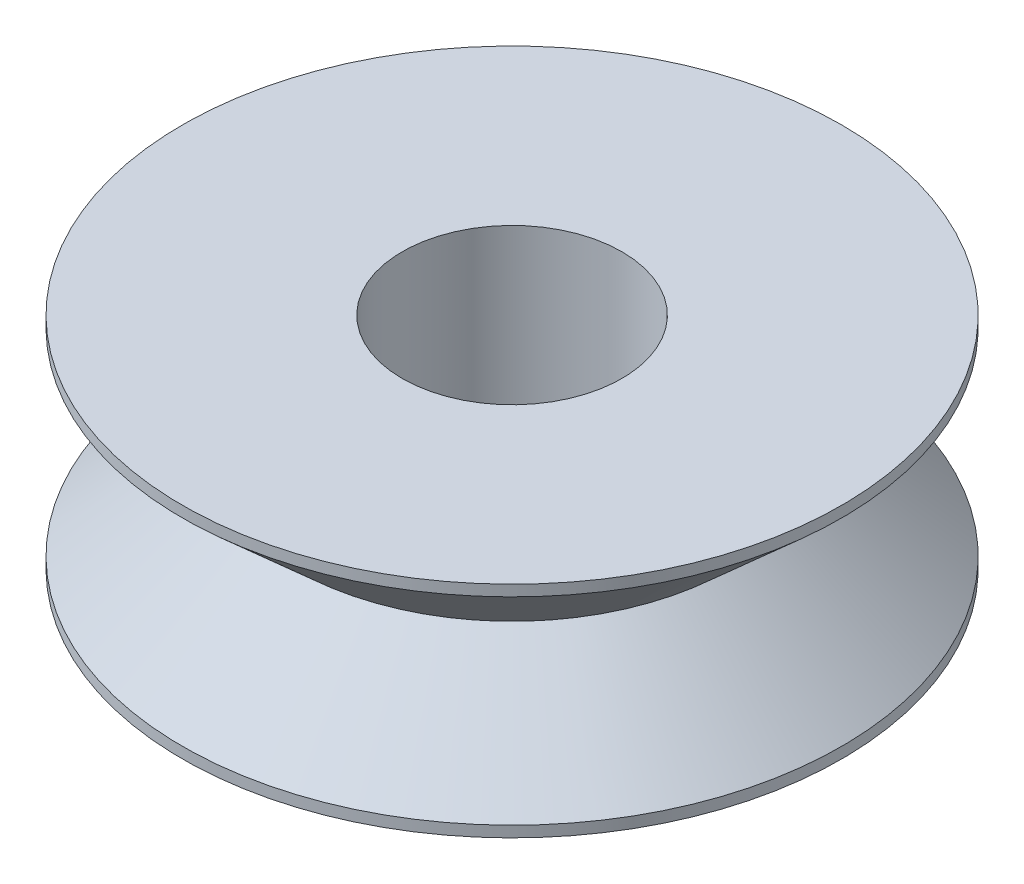
ISO-10303-21;
HEADER;
FILE_DESCRIPTION(('STEP AP214'),'2;1');
FILE_NAME('part.step','',(''),(''),'','','');
FILE_SCHEMA(('AUTOMOTIVE_DESIGN { 1 0 10303 214 1 1 1 1 }'));
ENDSEC;
DATA;
#1=APPLICATION_CONTEXT('core data for automotive mechanical design processes');
#2=APPLICATION_PROTOCOL_DEFINITION('international standard','automotive_design',2000,#1);
#3=PRODUCT_CONTEXT('',#1,'mechanical');
#4=PRODUCT('Part','Part','',(#3));
#5=PRODUCT_RELATED_PRODUCT_CATEGORY('part','',(#4));
#6=PRODUCT_DEFINITION_FORMATION('','',#4);
#7=PRODUCT_DEFINITION_CONTEXT('part definition',#1,'design');
#8=PRODUCT_DEFINITION('design','',#6,#7);
#9=PRODUCT_DEFINITION_SHAPE('','',#8);
#10=(LENGTH_UNIT() NAMED_UNIT(*) SI_UNIT(.MILLI.,.METRE.));
#11=(NAMED_UNIT(*) PLANE_ANGLE_UNIT() SI_UNIT($,.RADIAN.));
#12=(NAMED_UNIT(*) SI_UNIT($,.STERADIAN.) SOLID_ANGLE_UNIT());
#13=UNCERTAINTY_MEASURE_WITH_UNIT(LENGTH_MEASURE(1.E-05),#10,'distance_accuracy_value','');
#14=(GEOMETRIC_REPRESENTATION_CONTEXT(3) GLOBAL_UNCERTAINTY_ASSIGNED_CONTEXT((#13)) GLOBAL_UNIT_ASSIGNED_CONTEXT((#10,
#11,#12)) REPRESENTATION_CONTEXT('',''));
#15=CARTESIAN_POINT('',(0.,0.,0.));
#16=DIRECTION('',(0.,0.,1.));
#17=DIRECTION('',(1.,0.,0.));
#18=AXIS2_PLACEMENT_3D('',#15,#16,#17);
#19=CARTESIAN_POINT('',(0.,0.,0.));
#20=DIRECTION('',(0.,-1.,0.));
#21=DIRECTION('',(0.,0.,-1.));
#22=AXIS2_PLACEMENT_3D('',#19,#20,#21);
#23=CYLINDRICAL_SURFACE('',#22,6.);
#24=CARTESIAN_POINT('',(0.,0.2,0.));
#25=DIRECTION('',(0.,-1.,0.));
#26=DIRECTION('',(0.,0.,-1.));
#27=AXIS2_PLACEMENT_3D('',#24,#25,#26);
#28=CIRCLE('',#27,6.);
#29=CARTESIAN_POINT('',(0.,0.2,-6.));
#30=VERTEX_POINT('',#29);
#31=EDGE_CURVE('E10',#30,#30,#28,.T.);
#32=ORIENTED_EDGE('',*,*,#31,.T.);
#33=EDGE_LOOP('',(#32));
#34=FACE_BOUND('',#33,.T.);
#35=CARTESIAN_POINT('',(0.,0.,0.));
#36=DIRECTION('',(0.,-1.,0.));
#37=DIRECTION('',(0.,0.,-1.));
#38=AXIS2_PLACEMENT_3D('',#35,#36,#37);
#39=CIRCLE('',#38,6.);
#40=CARTESIAN_POINT('',(0.,0.,-6.));
#41=VERTEX_POINT('',#40);
#42=EDGE_CURVE('E57',#41,#41,#39,.T.);
#43=ORIENTED_EDGE('',*,*,#42,.F.);
#44=EDGE_LOOP('',(#43));
#45=FACE_BOUND('',#44,.T.);
#46=ADVANCED_FACE('F32',(#34,#45),#23,.T.);
#47=CARTESIAN_POINT('',(0.,0.2,0.));
#48=DIRECTION('',(0.,-1.,0.));
#49=DIRECTION('',(0.,0.,-1.));
#50=AXIS2_PLACEMENT_3D('',#47,#48,#49);
#51=CONICAL_SURFACE('',#50,6.,0.83798122500839);
#52=CARTESIAN_POINT('',(0.,2.,0.));
#53=DIRECTION('',(0.,-1.,0.));
#54=DIRECTION('',(0.,0.,-1.));
#55=AXIS2_PLACEMENT_3D('',#52,#53,#54);
#56=CIRCLE('',#55,4.);
#57=CARTESIAN_POINT('',(0.,2.,-4.));
#58=VERTEX_POINT('',#57);
#59=EDGE_CURVE('E38',#58,#58,#56,.T.);
#60=ORIENTED_EDGE('',*,*,#59,.T.);
#61=EDGE_LOOP('',(#60));
#62=FACE_BOUND('',#61,.T.);
#63=ORIENTED_EDGE('',*,*,#31,.F.);
#64=EDGE_LOOP('',(#63));
#65=FACE_BOUND('',#64,.T.);
#66=ADVANCED_FACE('F65',(#62,#65),#51,.T.);
#67=CARTESIAN_POINT('',(0.,2.,0.));
#68=DIRECTION('',(0.,1.,0.));
#69=DIRECTION('',(0.,0.,1.));
#70=AXIS2_PLACEMENT_3D('',#67,#68,#69);
#71=CONICAL_SURFACE('',#70,4.,0.83798122500839);
#72=CARTESIAN_POINT('',(0.,3.8,0.));
#73=DIRECTION('',(0.,-1.,0.));
#74=DIRECTION('',(0.,0.,-1.));
#75=AXIS2_PLACEMENT_3D('',#72,#73,#74);
#76=CIRCLE('',#75,6.);
#77=CARTESIAN_POINT('',(0.,3.8,-6.));
#78=VERTEX_POINT('',#77);
#79=EDGE_CURVE('E42',#78,#78,#76,.T.);
#80=ORIENTED_EDGE('',*,*,#79,.T.);
#81=EDGE_LOOP('',(#80));
#82=FACE_BOUND('',#81,.T.);
#83=ORIENTED_EDGE('',*,*,#59,.F.);
#84=EDGE_LOOP('',(#83));
#85=FACE_BOUND('',#84,.T.);
#86=ADVANCED_FACE('F69',(#82,#85),#71,.T.);
#87=CARTESIAN_POINT('',(0.,0.,0.));
#88=DIRECTION('',(0.,-1.,0.));
#89=DIRECTION('',(0.,0.,-1.));
#90=AXIS2_PLACEMENT_3D('',#87,#88,#89);
#91=CYLINDRICAL_SURFACE('',#90,6.);
#92=CARTESIAN_POINT('',(0.,4.,0.));
#93=DIRECTION('',(0.,-1.,0.));
#94=DIRECTION('',(0.,0.,-1.));
#95=AXIS2_PLACEMENT_3D('',#92,#93,#94);
#96=CIRCLE('',#95,6.);
#97=CARTESIAN_POINT('',(0.,4.,-6.));
#98=VERTEX_POINT('',#97);
#99=EDGE_CURVE('E46',#98,#98,#96,.T.);
#100=ORIENTED_EDGE('',*,*,#99,.T.);
#101=EDGE_LOOP('',(#100));
#102=FACE_BOUND('',#101,.T.);
#103=ORIENTED_EDGE('',*,*,#79,.F.);
#104=EDGE_LOOP('',(#103));
#105=FACE_BOUND('',#104,.T.);
#106=ADVANCED_FACE('F73',(#102,#105),#91,.T.);
#107=CARTESIAN_POINT('',(2.,4.,0.));
#108=DIRECTION('',(0.,1.,0.));
#109=DIRECTION('',(0.,0.,1.));
#110=AXIS2_PLACEMENT_3D('',#107,#108,#109);
#111=PLANE('',#110);
#112=CARTESIAN_POINT('',(0.,4.,0.));
#113=DIRECTION('',(0.,-1.,0.));
#114=DIRECTION('',(0.,0.,-1.));
#115=AXIS2_PLACEMENT_3D('',#112,#113,#114);
#116=CIRCLE('',#115,2.);
#117=CARTESIAN_POINT('',(0.,4.,-2.));
#118=VERTEX_POINT('',#117);
#119=EDGE_CURVE('E51',#118,#118,#116,.T.);
#120=ORIENTED_EDGE('',*,*,#119,.T.);
#121=EDGE_LOOP('',(#120));
#122=FACE_BOUND('',#121,.T.);
#123=ORIENTED_EDGE('',*,*,#99,.F.);
#124=EDGE_LOOP('',(#123));
#125=FACE_BOUND('',#124,.T.);
#126=ADVANCED_FACE('F80',(#122,#125),#111,.T.);
#127=CARTESIAN_POINT('',(0.,0.,0.));
#128=DIRECTION('',(0.,-1.,0.));
#129=DIRECTION('',(0.,0.,-1.));
#130=AXIS2_PLACEMENT_3D('',#127,#128,#129);
#131=CYLINDRICAL_SURFACE('',#130,2.);
#132=CARTESIAN_POINT('',(0.,0.,0.));
#133=DIRECTION('',(0.,-1.,0.));
#134=DIRECTION('',(0.,0.,-1.));
#135=AXIS2_PLACEMENT_3D('',#132,#133,#134);
#136=CIRCLE('',#135,2.);
#137=CARTESIAN_POINT('',(0.,0.,-2.));
#138=VERTEX_POINT('',#137);
#139=EDGE_CURVE('E54',#138,#138,#136,.T.);
#140=ORIENTED_EDGE('',*,*,#139,.T.);
#141=EDGE_LOOP('',(#140));
#142=FACE_BOUND('',#141,.T.);
#143=ORIENTED_EDGE('',*,*,#119,.F.);
#144=EDGE_LOOP('',(#143));
#145=FACE_BOUND('',#144,.T.);
#146=ADVANCED_FACE('F84',(#142,#145),#131,.F.);
#147=CARTESIAN_POINT('',(2.,0.,0.));
#148=DIRECTION('',(0.,-1.,0.));
#149=DIRECTION('',(0.,0.,-1.));
#150=AXIS2_PLACEMENT_3D('',#147,#148,#149);
#151=PLANE('',#150);
#152=ORIENTED_EDGE('',*,*,#42,.T.);
#153=EDGE_LOOP('',(#152));
#154=FACE_BOUND('',#153,.T.);
#155=ORIENTED_EDGE('',*,*,#139,.F.);
#156=EDGE_LOOP('',(#155));
#157=FACE_BOUND('',#156,.T.);
#158=ADVANCED_FACE('F61',(#154,#157),#151,.T.);
#159=CLOSED_SHELL('',(#46,#66,#86,#106,#126,#146,#158));
#160=MANIFOLD_SOLID_BREP('B2',#159);
#161=ADVANCED_BREP_SHAPE_REPRESENTATION('',(#18,#160),#14);
#162=SHAPE_DEFINITION_REPRESENTATION(#9,#161);
ENDSEC;
END-ISO-10303-21;
